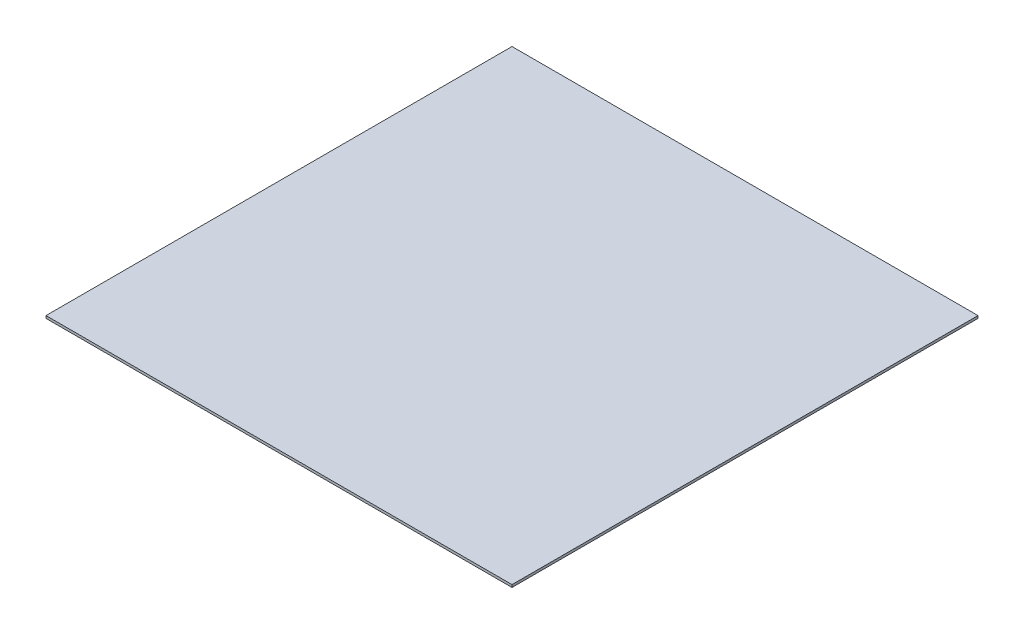
ISO-10303-21;
HEADER;
FILE_DESCRIPTION(('STEP AP214'),'2;1');
FILE_NAME('part.step','',(''),(''),'','','');
FILE_SCHEMA(('AUTOMOTIVE_DESIGN { 1 0 10303 214 1 1 1 1 }'));
ENDSEC;
DATA;
#1=APPLICATION_CONTEXT('core data for automotive mechanical design processes');
#2=APPLICATION_PROTOCOL_DEFINITION('international standard','automotive_design',2000,#1);
#3=PRODUCT_CONTEXT('',#1,'mechanical');
#4=PRODUCT('Part','Part','',(#3));
#5=PRODUCT_RELATED_PRODUCT_CATEGORY('part','',(#4));
#6=PRODUCT_DEFINITION_FORMATION('','',#4);
#7=PRODUCT_DEFINITION_CONTEXT('part definition',#1,'design');
#8=PRODUCT_DEFINITION('design','',#6,#7);
#9=PRODUCT_DEFINITION_SHAPE('','',#8);
#10=(LENGTH_UNIT() NAMED_UNIT(*) SI_UNIT(.MILLI.,.METRE.));
#11=(NAMED_UNIT(*) PLANE_ANGLE_UNIT() SI_UNIT($,.RADIAN.));
#12=(NAMED_UNIT(*) SI_UNIT($,.STERADIAN.) SOLID_ANGLE_UNIT());
#13=UNCERTAINTY_MEASURE_WITH_UNIT(LENGTH_MEASURE(1.E-05),#10,'distance_accuracy_value','');
#14=(GEOMETRIC_REPRESENTATION_CONTEXT(3) GLOBAL_UNCERTAINTY_ASSIGNED_CONTEXT((#13)) GLOBAL_UNIT_ASSIGNED_CONTEXT((#10,
#11,#12)) REPRESENTATION_CONTEXT('',''));
#15=CARTESIAN_POINT('',(0.,0.,0.));
#16=DIRECTION('',(0.,0.,1.));
#17=DIRECTION('',(1.,0.,0.));
#18=AXIS2_PLACEMENT_3D('',#15,#16,#17);
#19=CARTESIAN_POINT('',(150.,1.6,150.));
#20=DIRECTION('',(-1.,0.,0.));
#21=DIRECTION('',(0.,0.,1.));
#22=AXIS2_PLACEMENT_3D('',#19,#20,#21);
#23=PLANE('',#22);
#24=DIRECTION('',(0.,0.,-1.));
#25=VECTOR('',#24,1.);
#26=CARTESIAN_POINT('',(150.,0.,150.));
#27=LINE('',#26,#25);
#28=CARTESIAN_POINT('',(150.,0.,150.));
#29=VERTEX_POINT('',#28);
#30=CARTESIAN_POINT('',(150.,0.,-150.));
#31=VERTEX_POINT('',#30);
#32=EDGE_CURVE('E115',#29,#31,#27,.T.);
#33=ORIENTED_EDGE('',*,*,#32,.T.);
#34=DIRECTION('',(0.,-1.,0.));
#35=VECTOR('',#34,1.);
#36=CARTESIAN_POINT('',(150.,1.6,-150.));
#37=LINE('',#36,#35);
#38=CARTESIAN_POINT('',(150.,1.6,-150.));
#39=VERTEX_POINT('',#38);
#40=EDGE_CURVE('E11',#39,#31,#37,.T.);
#41=ORIENTED_EDGE('',*,*,#40,.F.);
#42=DIRECTION('',(0.,0.,-1.));
#43=VECTOR('',#42,1.);
#44=CARTESIAN_POINT('',(150.,1.6,150.));
#45=LINE('',#44,#43);
#46=CARTESIAN_POINT('',(150.,1.6,150.));
#47=VERTEX_POINT('',#46);
#48=EDGE_CURVE('E99',#47,#39,#45,.T.);
#49=ORIENTED_EDGE('',*,*,#48,.F.);
#50=DIRECTION('',(0.,-1.,0.));
#51=VECTOR('',#50,1.);
#52=CARTESIAN_POINT('',(150.,1.6,150.));
#53=LINE('',#52,#51);
#54=EDGE_CURVE('E111',#47,#29,#53,.T.);
#55=ORIENTED_EDGE('',*,*,#54,.T.);
#56=EDGE_LOOP('',(#33,#41,#49,#55));
#57=FACE_BOUND('',#56,.T.);
#58=ADVANCED_FACE('F47',(#57),#23,.F.);
#59=CARTESIAN_POINT('',(-150.,1.6,-150.));
#60=DIRECTION('',(0.,0.,1.));
#61=DIRECTION('',(1.,0.,0.));
#62=AXIS2_PLACEMENT_3D('',#59,#60,#61);
#63=PLANE('',#62);
#64=DIRECTION('',(-1.,0.,0.));
#65=VECTOR('',#64,1.);
#66=CARTESIAN_POINT('',(-150.,0.,-150.));
#67=LINE('',#66,#65);
#68=CARTESIAN_POINT('',(-150.,0.,-150.));
#69=VERTEX_POINT('',#68);
#70=EDGE_CURVE('E104',#31,#69,#67,.T.);
#71=ORIENTED_EDGE('',*,*,#70,.T.);
#72=DIRECTION('',(0.,-1.,0.));
#73=VECTOR('',#72,1.);
#74=CARTESIAN_POINT('',(-150.,1.6,-150.));
#75=LINE('',#74,#73);
#76=CARTESIAN_POINT('',(-150.,1.6,-150.));
#77=VERTEX_POINT('',#76);
#78=EDGE_CURVE('E56',#77,#69,#75,.T.);
#79=ORIENTED_EDGE('',*,*,#78,.F.);
#80=DIRECTION('',(-1.,0.,0.));
#81=VECTOR('',#80,1.);
#82=CARTESIAN_POINT('',(-150.,1.6,-150.));
#83=LINE('',#82,#81);
#84=EDGE_CURVE('E94',#39,#77,#83,.T.);
#85=ORIENTED_EDGE('',*,*,#84,.F.);
#86=ORIENTED_EDGE('',*,*,#40,.T.);
#87=EDGE_LOOP('',(#71,#79,#85,#86));
#88=FACE_BOUND('',#87,.T.);
#89=ADVANCED_FACE('F103',(#88),#63,.F.);
#90=CARTESIAN_POINT('',(-150.,1.6,150.));
#91=DIRECTION('',(1.,0.,0.));
#92=DIRECTION('',(0.,0.,-1.));
#93=AXIS2_PLACEMENT_3D('',#90,#91,#92);
#94=PLANE('',#93);
#95=DIRECTION('',(0.,0.,1.));
#96=VECTOR('',#95,1.);
#97=CARTESIAN_POINT('',(-150.,0.,150.));
#98=LINE('',#97,#96);
#99=CARTESIAN_POINT('',(-150.,0.,150.));
#100=VERTEX_POINT('',#99);
#101=EDGE_CURVE('E81',#69,#100,#98,.T.);
#102=ORIENTED_EDGE('',*,*,#101,.T.);
#103=DIRECTION('',(0.,-1.,0.));
#104=VECTOR('',#103,1.);
#105=CARTESIAN_POINT('',(-150.,1.6,150.));
#106=LINE('',#105,#104);
#107=CARTESIAN_POINT('',(-150.,1.6,150.));
#108=VERTEX_POINT('',#107);
#109=EDGE_CURVE('E106',#108,#100,#106,.T.);
#110=ORIENTED_EDGE('',*,*,#109,.F.);
#111=DIRECTION('',(0.,0.,1.));
#112=VECTOR('',#111,1.);
#113=CARTESIAN_POINT('',(-150.,1.6,150.));
#114=LINE('',#113,#112);
#115=EDGE_CURVE('E97',#77,#108,#114,.T.);
#116=ORIENTED_EDGE('',*,*,#115,.F.);
#117=ORIENTED_EDGE('',*,*,#78,.T.);
#118=EDGE_LOOP('',(#102,#110,#116,#117));
#119=FACE_BOUND('',#118,.T.);
#120=ADVANCED_FACE('F107',(#119),#94,.F.);
#121=CARTESIAN_POINT('',(-150.,1.6,150.));
#122=DIRECTION('',(0.,0.,-1.));
#123=DIRECTION('',(-1.,0.,0.));
#124=AXIS2_PLACEMENT_3D('',#121,#122,#123);
#125=PLANE('',#124);
#126=DIRECTION('',(1.,0.,0.));
#127=VECTOR('',#126,1.);
#128=CARTESIAN_POINT('',(-150.,0.,150.));
#129=LINE('',#128,#127);
#130=EDGE_CURVE('E87',#100,#29,#129,.T.);
#131=ORIENTED_EDGE('',*,*,#130,.T.);
#132=ORIENTED_EDGE('',*,*,#54,.F.);
#133=DIRECTION('',(1.,0.,0.));
#134=VECTOR('',#133,1.);
#135=CARTESIAN_POINT('',(-150.,1.6,150.));
#136=LINE('',#135,#134);
#137=EDGE_CURVE('E64',#108,#47,#136,.T.);
#138=ORIENTED_EDGE('',*,*,#137,.F.);
#139=ORIENTED_EDGE('',*,*,#109,.T.);
#140=EDGE_LOOP('',(#131,#132,#138,#139));
#141=FACE_BOUND('',#140,.T.);
#142=ADVANCED_FACE('F128',(#141),#125,.F.);
#143=CARTESIAN_POINT('',(0.,1.6,0.));
#144=DIRECTION('',(0.,-1.,0.));
#145=DIRECTION('',(0.,0.,-1.));
#146=AXIS2_PLACEMENT_3D('',#143,#144,#145);
#147=PLANE('',#146);
#148=ORIENTED_EDGE('',*,*,#48,.T.);
#149=ORIENTED_EDGE('',*,*,#84,.T.);
#150=ORIENTED_EDGE('',*,*,#115,.T.);
#151=ORIENTED_EDGE('',*,*,#137,.T.);
#152=EDGE_LOOP('',(#148,#149,#150,#151));
#153=FACE_BOUND('',#152,.T.);
#154=ADVANCED_FACE('F95',(#153),#147,.F.);
#155=CARTESIAN_POINT('',(0.,0.,0.));
#156=DIRECTION('',(0.,-1.,0.));
#157=DIRECTION('',(0.,0.,-1.));
#158=AXIS2_PLACEMENT_3D('',#155,#156,#157);
#159=PLANE('',#158);
#160=ORIENTED_EDGE('',*,*,#32,.F.);
#161=ORIENTED_EDGE('',*,*,#130,.F.);
#162=ORIENTED_EDGE('',*,*,#101,.F.);
#163=ORIENTED_EDGE('',*,*,#70,.F.);
#164=EDGE_LOOP('',(#160,#161,#162,#163));
#165=FACE_BOUND('',#164,.T.);
#166=ADVANCED_FACE('F131',(#165),#159,.T.);
#167=CLOSED_SHELL('',(#58,#89,#120,#142,#154,#166));
#168=MANIFOLD_SOLID_BREP('B2',#167);
#169=ADVANCED_BREP_SHAPE_REPRESENTATION('',(#18,#168),#14);
#170=SHAPE_DEFINITION_REPRESENTATION(#9,#169);
ENDSEC;
END-ISO-10303-21;
